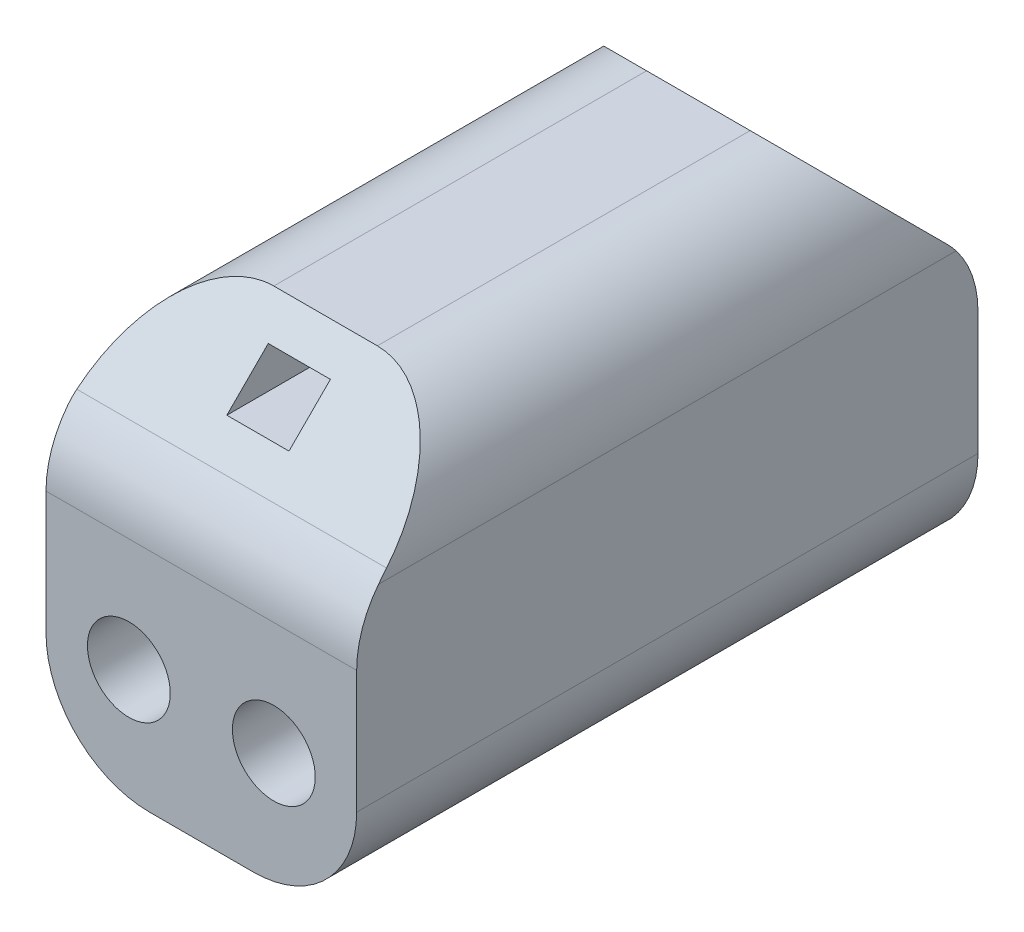
ISO-10303-21;
HEADER;
FILE_DESCRIPTION(('STEP AP214'),'2;1');
FILE_NAME('part.step','',(''),(''),'','','');
FILE_SCHEMA(('AUTOMOTIVE_DESIGN { 1 0 10303 214 1 1 1 1 }'));
ENDSEC;
DATA;
#1=APPLICATION_CONTEXT('core data for automotive mechanical design processes');
#2=APPLICATION_PROTOCOL_DEFINITION('international standard','automotive_design',2000,#1);
#3=PRODUCT_CONTEXT('',#1,'mechanical');
#4=PRODUCT('Part','Part','',(#3));
#5=PRODUCT_RELATED_PRODUCT_CATEGORY('part','',(#4));
#6=PRODUCT_DEFINITION_FORMATION('','',#4);
#7=PRODUCT_DEFINITION_CONTEXT('part definition',#1,'design');
#8=PRODUCT_DEFINITION('design','',#6,#7);
#9=PRODUCT_DEFINITION_SHAPE('','',#8);
#10=(LENGTH_UNIT() NAMED_UNIT(*) SI_UNIT(.MILLI.,.METRE.));
#11=(NAMED_UNIT(*) PLANE_ANGLE_UNIT() SI_UNIT($,.RADIAN.));
#12=(NAMED_UNIT(*) SI_UNIT($,.STERADIAN.) SOLID_ANGLE_UNIT());
#13=UNCERTAINTY_MEASURE_WITH_UNIT(LENGTH_MEASURE(1.E-05),#10,'distance_accuracy_value','');
#14=(GEOMETRIC_REPRESENTATION_CONTEXT(3) GLOBAL_UNCERTAINTY_ASSIGNED_CONTEXT((#13)) GLOBAL_UNIT_ASSIGNED_CONTEXT((#10,
#11,#12)) REPRESENTATION_CONTEXT('',''));
#15=CARTESIAN_POINT('',(0.,0.,0.));
#16=DIRECTION('',(0.,0.,1.));
#17=DIRECTION('',(1.,0.,0.));
#18=AXIS2_PLACEMENT_3D('',#15,#16,#17);
#19=CARTESIAN_POINT('',(7.5,-29.2167347703134,-22.0328397192485));
#20=DIRECTION('',(0.,1.,0.));
#21=DIRECTION('',(0.,0.,1.));
#22=AXIS2_PLACEMENT_3D('',#19,#20,#21);
#23=PLANE('',#22);
#24=DIRECTION('',(-1.,0.,0.));
#25=VECTOR('',#24,1.);
#26=CARTESIAN_POINT('',(7.5,-29.2167347703134,-22.0328397192485));
#27=LINE('',#26,#25);
#28=CARTESIAN_POINT('',(2.5,-29.2167347703134,-22.0328397192485));
#29=VERTEX_POINT('',#28);
#30=CARTESIAN_POINT('',(-2.5,-29.2167347703134,-22.0328397192485));
#31=VERTEX_POINT('',#30);
#32=EDGE_CURVE('E224',#29,#31,#27,.T.);
#33=ORIENTED_EDGE('',*,*,#32,.F.);
#34=DIRECTION('',(0.,0.,-1.));
#35=VECTOR('',#34,1.);
#36=CARTESIAN_POINT('',(2.5,-29.2167347703134,-22.0328397192485));
#37=LINE('',#36,#35);
#38=CARTESIAN_POINT('',(2.5,-29.2167347703134,7.96716028075147));
#39=VERTEX_POINT('',#38);
#40=EDGE_CURVE('E290',#29,#39,#37,.F.);
#41=ORIENTED_EDGE('',*,*,#40,.T.);
#42=DIRECTION('',(-1.,0.,0.));
#43=VECTOR('',#42,1.);
#44=CARTESIAN_POINT('',(7.5,-29.2167347703134,7.96716028075147));
#45=LINE('',#44,#43);
#46=CARTESIAN_POINT('',(-2.5,-29.2167347703134,7.96716028075147));
#47=VERTEX_POINT('',#46);
#48=EDGE_CURVE('E202',#39,#47,#45,.T.);
#49=ORIENTED_EDGE('',*,*,#48,.T.);
#50=DIRECTION('',(0.,0.,-1.));
#51=VECTOR('',#50,1.);
#52=CARTESIAN_POINT('',(-2.5,-29.2167347703134,-22.0328397192485));
#53=LINE('',#52,#51);
#54=EDGE_CURVE('E284',#47,#31,#53,.T.);
#55=ORIENTED_EDGE('',*,*,#54,.T.);
#56=EDGE_LOOP('',(#33,#41,#49,#55));
#57=FACE_BOUND('',#56,.T.);
#58=ADVANCED_FACE('F42',(#57),#23,.F.);
#59=CARTESIAN_POINT('',(7.5,-16.2167347703134,-22.0328397192485));
#60=DIRECTION('',(0.,0.,1.));
#61=DIRECTION('',(0.,-1.,0.));
#62=AXIS2_PLACEMENT_3D('',#59,#60,#61);
#63=PLANE('',#62);
#64=CARTESIAN_POINT('',(3.5,-23.7522686762461,-22.0328397192485));
#65=DIRECTION('',(0.,0.,1.));
#66=DIRECTION('',(0.,-1.,0.));
#67=AXIS2_PLACEMENT_3D('',#64,#65,#66);
#68=CIRCLE('',#67,2.);
#69=CARTESIAN_POINT('',(3.5,-25.7522686762461,-22.0328397192485));
#70=VERTEX_POINT('',#69);
#71=EDGE_CURVE('E171',#70,#70,#68,.T.);
#72=ORIENTED_EDGE('',*,*,#71,.T.);
#73=EDGE_LOOP('',(#72));
#74=FACE_BOUND('',#73,.T.);
#75=CARTESIAN_POINT('',(-3.5,-23.7522686762461,-22.0328397192485));
#76=DIRECTION('',(0.,0.,1.));
#77=DIRECTION('',(0.,-1.,0.));
#78=AXIS2_PLACEMENT_3D('',#75,#76,#77);
#79=CIRCLE('',#78,2.);
#80=CARTESIAN_POINT('',(-3.5,-25.7522686762461,-22.0328397192485));
#81=VERTEX_POINT('',#80);
#82=EDGE_CURVE('E260',#81,#81,#79,.T.);
#83=ORIENTED_EDGE('',*,*,#82,.T.);
#84=EDGE_LOOP('',(#83));
#85=FACE_BOUND('',#84,.T.);
#86=DIRECTION('',(0.,1.,0.));
#87=VECTOR('',#86,1.);
#88=CARTESIAN_POINT('',(7.5,-16.2167347703134,-22.0328397192485));
#89=LINE('',#88,#87);
#90=CARTESIAN_POINT('',(7.5,-24.2167347703134,-22.0328397192485));
#91=VERTEX_POINT('',#90);
#92=CARTESIAN_POINT('',(7.5,-18.2878025821789,-22.0328397192485));
#93=VERTEX_POINT('',#92);
#94=EDGE_CURVE('E199',#91,#93,#89,.T.);
#95=ORIENTED_EDGE('',*,*,#94,.F.);
#96=CARTESIAN_POINT('',(2.5,-24.2167347703134,-22.0328397192485));
#97=DIRECTION('',(0.,0.,1.));
#98=DIRECTION('',(0.,-1.,0.));
#99=AXIS2_PLACEMENT_3D('',#96,#97,#98);
#100=CIRCLE('',#99,5.);
#101=EDGE_CURVE('E282',#91,#29,#100,.F.);
#102=ORIENTED_EDGE('',*,*,#101,.T.);
#103=ORIENTED_EDGE('',*,*,#32,.T.);
#104=CARTESIAN_POINT('',(-2.5,-24.2167347703134,-22.0328397192485));
#105=DIRECTION('',(0.,0.,1.));
#106=DIRECTION('',(0.,-1.,0.));
#107=AXIS2_PLACEMENT_3D('',#104,#105,#106);
#108=CIRCLE('',#107,5.);
#109=CARTESIAN_POINT('',(-7.5,-24.2167347703134,-22.0328397192485));
#110=VERTEX_POINT('',#109);
#111=EDGE_CURVE('E277',#31,#110,#108,.F.);
#112=ORIENTED_EDGE('',*,*,#111,.T.);
#113=DIRECTION('',(0.,1.,0.));
#114=VECTOR('',#113,1.);
#115=CARTESIAN_POINT('',(-7.5,-16.2167347703134,-22.0328397192485));
#116=LINE('',#115,#114);
#117=CARTESIAN_POINT('',(-7.5,-18.2878025821789,-22.0328397192485));
#118=VERTEX_POINT('',#117);
#119=EDGE_CURVE('E186',#110,#118,#116,.T.);
#120=ORIENTED_EDGE('',*,*,#119,.T.);
#121=DIRECTION('',(-1.,0.,0.));
#122=VECTOR('',#121,1.);
#123=CARTESIAN_POINT('',(7.5,-18.2878025821789,-22.0328397192485));
#124=LINE('',#123,#122);
#125=EDGE_CURVE('E248',#118,#93,#124,.F.);
#126=ORIENTED_EDGE('',*,*,#125,.T.);
#127=EDGE_LOOP('',(#95,#102,#103,#112,#120,#126));
#128=FACE_BOUND('',#127,.T.);
#129=ADVANCED_FACE('F363',(#74,#85,#128),#63,.F.);
#130=CARTESIAN_POINT('',(7.5,-10.2167347703134,-16.0328397192485));
#131=DIRECTION('',(0.,-0.707106781186552,0.707106781186543));
#132=DIRECTION('',(0.,-0.707106781186543,-0.707106781186552));
#133=AXIS2_PLACEMENT_3D('',#130,#131,#132);
#134=PLANE('',#133);
#135=DIRECTION('',(1.,0.,0.));
#136=VECTOR('',#135,1.);
#137=CARTESIAN_POINT('',(7.5,-13.4845017232798,-19.3006066722149));
#138=LINE('',#137,#136);
#139=CARTESIAN_POINT('',(-1.5,-13.4845017232798,-19.3006066722149));
#140=VERTEX_POINT('',#139);
#141=CARTESIAN_POINT('',(1.5,-13.4845017232798,-19.3006066722149));
#142=VERTEX_POINT('',#141);
#143=EDGE_CURVE('E190',#140,#142,#138,.T.);
#144=ORIENTED_EDGE('',*,*,#143,.T.);
#145=DIRECTION('',(0.,0.707106781186543,0.707106781186552));
#146=VECTOR('',#145,1.);
#147=CARTESIAN_POINT('',(1.5,-10.2167347703134,-16.0328397192485));
#148=LINE('',#147,#146);
#149=CARTESIAN_POINT('',(1.5,-11.4845017232798,-17.3006066722148));
#150=VERTEX_POINT('',#149);
#151=EDGE_CURVE('E176',#142,#150,#148,.T.);
#152=ORIENTED_EDGE('',*,*,#151,.T.);
#153=DIRECTION('',(-1.,0.,0.));
#154=VECTOR('',#153,1.);
#155=CARTESIAN_POINT('',(7.5,-11.4845017232798,-17.3006066722148));
#156=LINE('',#155,#154);
#157=CARTESIAN_POINT('',(-1.5,-11.4845017232798,-17.3006066722148));
#158=VERTEX_POINT('',#157);
#159=EDGE_CURVE('E160',#150,#158,#156,.T.);
#160=ORIENTED_EDGE('',*,*,#159,.T.);
#161=DIRECTION('',(0.,-0.707106781186543,-0.707106781186552));
#162=VECTOR('',#161,1.);
#163=CARTESIAN_POINT('',(-1.5,-10.2167347703134,-16.0328397192485));
#164=LINE('',#163,#162);
#165=EDGE_CURVE('E167',#158,#140,#164,.T.);
#166=ORIENTED_EDGE('',*,*,#165,.T.);
#167=EDGE_LOOP('',(#144,#152,#160,#166));
#168=FACE_BOUND('',#167,.T.);
#169=DIRECTION('',(-1.,0.,0.));
#170=VECTOR('',#169,1.);
#171=CARTESIAN_POINT('',(7.5,-10.2167347703134,-16.0328397192485));
#172=LINE('',#171,#170);
#173=CARTESIAN_POINT('',(2.5,-10.2167347703134,-16.0328397192485));
#174=VERTEX_POINT('',#173);
#175=CARTESIAN_POINT('',(-2.5,-10.2167347703134,-16.0328397192485));
#176=VERTEX_POINT('',#175);
#177=EDGE_CURVE('E220',#174,#176,#172,.T.);
#178=ORIENTED_EDGE('',*,*,#177,.F.);
#179=CARTESIAN_POINT('',(2.5,-15.2167347703134,-21.0328397192485));
#180=DIRECTION('',(0.,-0.707106781186552,0.707106781186543));
#181=DIRECTION('',(0.,0.707106781186543,0.707106781186552));
#182=AXIS2_PLACEMENT_3D('',#179,#180,#181);
#183=ELLIPSE('',#182,7.07106781186552,5.);
#184=CARTESIAN_POINT('',(7.47838038396645,-14.7522686762461,-20.5683736251812));
#185=VERTEX_POINT('',#184);
#186=EDGE_CURVE('E412',#174,#185,#183,.F.);
#187=ORIENTED_EDGE('',*,*,#186,.T.);
#188=DIRECTION('',(-1.,0.,0.));
#189=VECTOR('',#188,1.);
#190=CARTESIAN_POINT('',(7.5,-14.7522686762461,-20.5683736251812));
#191=LINE('',#190,#189);
#192=CARTESIAN_POINT('',(-7.47838038396644,-14.7522686762461,-20.5683736251812));
#193=VERTEX_POINT('',#192);
#194=EDGE_CURVE('E246',#185,#193,#191,.T.);
#195=ORIENTED_EDGE('',*,*,#194,.T.);
#196=CARTESIAN_POINT('',(-2.5,-15.2167347703134,-21.0328397192485));
#197=DIRECTION('',(0.,-0.707106781186552,0.707106781186543));
#198=DIRECTION('',(0.,-0.707106781186543,-0.707106781186552));
#199=AXIS2_PLACEMENT_3D('',#196,#197,#198);
#200=ELLIPSE('',#199,7.07106781186552,5.);
#201=EDGE_CURVE('E408',#193,#176,#200,.F.);
#202=ORIENTED_EDGE('',*,*,#201,.T.);
#203=EDGE_LOOP('',(#178,#187,#195,#202));
#204=FACE_BOUND('',#203,.T.);
#205=ADVANCED_FACE('F184',(#168,#204),#134,.F.);
#206=CARTESIAN_POINT('',(7.5,-10.2167347703134,1.9671602807514));
#207=DIRECTION('',(0.,-1.,0.));
#208=DIRECTION('',(0.,0.,-1.));
#209=AXIS2_PLACEMENT_3D('',#206,#207,#208);
#210=PLANE('',#209);
#211=DIRECTION('',(-1.,0.,0.));
#212=VECTOR('',#211,1.);
#213=CARTESIAN_POINT('',(7.5,-10.2167347703134,1.9671602807514));
#214=LINE('',#213,#212);
#215=CARTESIAN_POINT('',(2.5,-10.2167347703134,1.9671602807514));
#216=VERTEX_POINT('',#215);
#217=CARTESIAN_POINT('',(-2.5,-10.2167347703134,1.9671602807514));
#218=VERTEX_POINT('',#217);
#219=EDGE_CURVE('E212',#216,#218,#214,.T.);
#220=ORIENTED_EDGE('',*,*,#219,.F.);
#221=DIRECTION('',(0.,0.,1.));
#222=VECTOR('',#221,1.);
#223=CARTESIAN_POINT('',(2.5,-10.2167347703134,1.9671602807514));
#224=LINE('',#223,#222);
#225=EDGE_CURVE('E406',#216,#174,#224,.F.);
#226=ORIENTED_EDGE('',*,*,#225,.T.);
#227=ORIENTED_EDGE('',*,*,#177,.T.);
#228=DIRECTION('',(0.,0.,1.));
#229=VECTOR('',#228,1.);
#230=CARTESIAN_POINT('',(-2.5,-10.2167347703134,1.9671602807514));
#231=LINE('',#230,#229);
#232=EDGE_CURVE('E397',#176,#218,#231,.T.);
#233=ORIENTED_EDGE('',*,*,#232,.T.);
#234=EDGE_LOOP('',(#220,#226,#227,#233));
#235=FACE_BOUND('',#234,.T.);
#236=ADVANCED_FACE('F420',(#235),#210,.F.);
#237=CARTESIAN_POINT('',(7.5,-16.2167347703134,7.96716028075146));
#238=DIRECTION('',(0.,-0.707106781186551,-0.707106781186544));
#239=DIRECTION('',(0.,0.707106781186544,-0.707106781186551));
#240=AXIS2_PLACEMENT_3D('',#237,#238,#239);
#241=PLANE('',#240);
#242=DIRECTION('',(1.,0.,0.));
#243=VECTOR('',#242,1.);
#244=CARTESIAN_POINT('',(7.5,-11.4845017232798,3.23492723371779));
#245=LINE('',#244,#243);
#246=CARTESIAN_POINT('',(-1.5,-11.4845017232798,3.23492723371779));
#247=VERTEX_POINT('',#246);
#248=CARTESIAN_POINT('',(1.5,-11.4845017232798,3.23492723371779));
#249=VERTEX_POINT('',#248);
#250=EDGE_CURVE('E254',#247,#249,#245,.T.);
#251=ORIENTED_EDGE('',*,*,#250,.T.);
#252=DIRECTION('',(0.,-0.707106781186544,0.707106781186551));
#253=VECTOR('',#252,1.);
#254=CARTESIAN_POINT('',(1.5,-16.2167347703134,7.96716028075146));
#255=LINE('',#254,#253);
#256=CARTESIAN_POINT('',(1.5,-13.4845017232798,5.23492723371781));
#257=VERTEX_POINT('',#256);
#258=EDGE_CURVE('E177',#249,#257,#255,.T.);
#259=ORIENTED_EDGE('',*,*,#258,.T.);
#260=DIRECTION('',(-1.,0.,0.));
#261=VECTOR('',#260,1.);
#262=CARTESIAN_POINT('',(7.5,-13.4845017232798,5.23492723371781));
#263=LINE('',#262,#261);
#264=CARTESIAN_POINT('',(-1.5,-13.4845017232798,5.23492723371779));
#265=VERTEX_POINT('',#264);
#266=EDGE_CURVE('E270',#257,#265,#263,.T.);
#267=ORIENTED_EDGE('',*,*,#266,.T.);
#268=DIRECTION('',(0.,0.707106781186544,-0.707106781186551));
#269=VECTOR('',#268,1.);
#270=CARTESIAN_POINT('',(-1.5,-16.2167347703134,7.96716028075146));
#271=LINE('',#270,#269);
#272=EDGE_CURVE('E264',#265,#247,#271,.T.);
#273=ORIENTED_EDGE('',*,*,#272,.T.);
#274=EDGE_LOOP('',(#251,#259,#267,#273));
#275=FACE_BOUND('',#274,.T.);
#276=DIRECTION('',(-1.,0.,0.));
#277=VECTOR('',#276,1.);
#278=CARTESIAN_POINT('',(7.5,-14.7522686762461,6.50269418668419));
#279=LINE('',#278,#277);
#280=CARTESIAN_POINT('',(-7.47838038396644,-14.7522686762461,6.50269418668419));
#281=VERTEX_POINT('',#280);
#282=CARTESIAN_POINT('',(7.47838038396645,-14.7522686762461,6.50269418668419));
#283=VERTEX_POINT('',#282);
#284=EDGE_CURVE('E232',#281,#283,#279,.F.);
#285=ORIENTED_EDGE('',*,*,#284,.T.);
#286=CARTESIAN_POINT('',(2.5,-15.2167347703134,6.96716028075145));
#287=DIRECTION('',(0.,-0.707106781186551,-0.707106781186544));
#288=DIRECTION('',(0.,-0.707106781186544,0.707106781186551));
#289=AXIS2_PLACEMENT_3D('',#286,#287,#288);
#290=ELLIPSE('',#289,7.07106781186551,5.);
#291=EDGE_CURVE('E394',#283,#216,#290,.F.);
#292=ORIENTED_EDGE('',*,*,#291,.T.);
#293=ORIENTED_EDGE('',*,*,#219,.T.);
#294=CARTESIAN_POINT('',(-2.5,-15.2167347703134,6.96716028075145));
#295=DIRECTION('',(0.,-0.707106781186551,-0.707106781186544));
#296=DIRECTION('',(0.,0.707106781186544,-0.707106781186551));
#297=AXIS2_PLACEMENT_3D('',#294,#295,#296);
#298=ELLIPSE('',#297,7.07106781186551,5.);
#299=EDGE_CURVE('E399',#218,#281,#298,.F.);
#300=ORIENTED_EDGE('',*,*,#299,.T.);
#301=EDGE_LOOP('',(#285,#292,#293,#300));
#302=FACE_BOUND('',#301,.T.);
#303=ADVANCED_FACE('F417',(#275,#302),#241,.F.);
#304=CARTESIAN_POINT('',(7.5,-29.2167347703134,7.96716028075147));
#305=DIRECTION('',(0.,0.,-1.));
#306=DIRECTION('',(0.,1.,0.));
#307=AXIS2_PLACEMENT_3D('',#304,#305,#306);
#308=PLANE('',#307);
#309=CARTESIAN_POINT('',(3.5,-23.7522686762461,7.96716028075146));
#310=DIRECTION('',(0.,0.,-1.));
#311=DIRECTION('',(0.,1.,0.));
#312=AXIS2_PLACEMENT_3D('',#309,#310,#311);
#313=CIRCLE('',#312,2.);
#314=CARTESIAN_POINT('',(3.5,-21.7522686762461,7.96716028075146));
#315=VERTEX_POINT('',#314);
#316=EDGE_CURVE('E257',#315,#315,#313,.T.);
#317=ORIENTED_EDGE('',*,*,#316,.T.);
#318=EDGE_LOOP('',(#317));
#319=FACE_BOUND('',#318,.T.);
#320=CARTESIAN_POINT('',(-3.5,-23.7522686762461,7.96716028075146));
#321=DIRECTION('',(0.,0.,-1.));
#322=DIRECTION('',(0.,1.,0.));
#323=AXIS2_PLACEMENT_3D('',#320,#321,#322);
#324=CIRCLE('',#323,2.);
#325=CARTESIAN_POINT('',(-3.5,-21.7522686762461,7.96716028075146));
#326=VERTEX_POINT('',#325);
#327=EDGE_CURVE('E185',#326,#326,#324,.T.);
#328=ORIENTED_EDGE('',*,*,#327,.T.);
#329=EDGE_LOOP('',(#328));
#330=FACE_BOUND('',#329,.T.);
#331=ORIENTED_EDGE('',*,*,#48,.F.);
#332=CARTESIAN_POINT('',(2.5,-24.2167347703134,7.96716028075147));
#333=DIRECTION('',(0.,0.,-1.));
#334=DIRECTION('',(0.,1.,0.));
#335=AXIS2_PLACEMENT_3D('',#332,#333,#334);
#336=CIRCLE('',#335,5.);
#337=CARTESIAN_POINT('',(7.5,-24.2167347703134,7.96716028075147));
#338=VERTEX_POINT('',#337);
#339=EDGE_CURVE('E295',#39,#338,#336,.F.);
#340=ORIENTED_EDGE('',*,*,#339,.T.);
#341=DIRECTION('',(0.,-1.,0.));
#342=VECTOR('',#341,1.);
#343=CARTESIAN_POINT('',(7.5,-29.2167347703134,7.96716028075147));
#344=LINE('',#343,#342);
#345=CARTESIAN_POINT('',(7.5,-18.2878025821789,7.96716028075146));
#346=VERTEX_POINT('',#345);
#347=EDGE_CURVE('E201',#346,#338,#344,.T.);
#348=ORIENTED_EDGE('',*,*,#347,.F.);
#349=DIRECTION('',(-1.,0.,0.));
#350=VECTOR('',#349,1.);
#351=CARTESIAN_POINT('',(7.5,-18.2878025821789,7.96716028075146));
#352=LINE('',#351,#350);
#353=CARTESIAN_POINT('',(-7.5,-18.2878025821789,7.96716028075146));
#354=VERTEX_POINT('',#353);
#355=EDGE_CURVE('E222',#346,#354,#352,.T.);
#356=ORIENTED_EDGE('',*,*,#355,.T.);
#357=DIRECTION('',(0.,-1.,0.));
#358=VECTOR('',#357,1.);
#359=CARTESIAN_POINT('',(-7.5,-29.2167347703134,7.96716028075147));
#360=LINE('',#359,#358);
#361=CARTESIAN_POINT('',(-7.5,-24.2167347703134,7.96716028075147));
#362=VERTEX_POINT('',#361);
#363=EDGE_CURVE('E193',#354,#362,#360,.T.);
#364=ORIENTED_EDGE('',*,*,#363,.T.);
#365=CARTESIAN_POINT('',(-2.5,-24.2167347703134,7.96716028075146));
#366=DIRECTION('',(0.,0.,-1.));
#367=DIRECTION('',(0.,1.,0.));
#368=AXIS2_PLACEMENT_3D('',#365,#366,#367);
#369=CIRCLE('',#368,5.);
#370=EDGE_CURVE('E293',#362,#47,#369,.F.);
#371=ORIENTED_EDGE('',*,*,#370,.T.);
#372=EDGE_LOOP('',(#331,#340,#348,#356,#364,#371));
#373=FACE_BOUND('',#372,.T.);
#374=ADVANCED_FACE('F380',(#319,#330,#373),#308,.F.);
#375=CARTESIAN_POINT('',(7.5,0.,0.));
#376=DIRECTION('',(-1.,0.,0.));
#377=DIRECTION('',(0.,0.,1.));
#378=AXIS2_PLACEMENT_3D('',#375,#376,#377);
#379=PLANE('',#378);
#380=CARTESIAN_POINT('',(7.5,-18.2878025821789,-17.0328397192485));
#381=DIRECTION('',(-1.,0.,0.));
#382=DIRECTION('',(0.,0.,1.));
#383=AXIS2_PLACEMENT_3D('',#380,#381,#382);
#384=CIRCLE('',#383,5.);
#385=CARTESIAN_POINT('',(7.5,-15.2167347703134,-20.978538959551));
#386=VERTEX_POINT('',#385);
#387=EDGE_CURVE('E237',#93,#386,#384,.F.);
#388=ORIENTED_EDGE('',*,*,#387,.T.);
#389=DIRECTION('',(0.,0.,1.));
#390=VECTOR('',#389,1.);
#391=CARTESIAN_POINT('',(7.5,-15.2167347703134,0.));
#392=LINE('',#391,#390);
#393=CARTESIAN_POINT('',(7.5,-15.2167347703134,6.91285952105396));
#394=VERTEX_POINT('',#393);
#395=EDGE_CURVE('E297',#386,#394,#392,.T.);
#396=ORIENTED_EDGE('',*,*,#395,.T.);
#397=CARTESIAN_POINT('',(7.5,-18.2878025821789,2.96716028075146));
#398=DIRECTION('',(-1.,0.,0.));
#399=DIRECTION('',(0.,0.,1.));
#400=AXIS2_PLACEMENT_3D('',#397,#398,#399);
#401=CIRCLE('',#400,5.);
#402=EDGE_CURVE('E243',#394,#346,#401,.F.);
#403=ORIENTED_EDGE('',*,*,#402,.T.);
#404=ORIENTED_EDGE('',*,*,#347,.T.);
#405=DIRECTION('',(0.,0.,-1.));
#406=VECTOR('',#405,1.);
#407=CARTESIAN_POINT('',(7.5,-24.2167347703134,0.));
#408=LINE('',#407,#406);
#409=EDGE_CURVE('E274',#338,#91,#408,.T.);
#410=ORIENTED_EDGE('',*,*,#409,.T.);
#411=ORIENTED_EDGE('',*,*,#94,.T.);
#412=EDGE_LOOP('',(#388,#396,#403,#404,#410,#411));
#413=FACE_BOUND('',#412,.T.);
#414=ADVANCED_FACE('F379',(#413),#379,.F.);
#415=CARTESIAN_POINT('',(-7.5,0.,0.));
#416=DIRECTION('',(-1.,0.,0.));
#417=DIRECTION('',(0.,0.,1.));
#418=AXIS2_PLACEMENT_3D('',#415,#416,#417);
#419=PLANE('',#418);
#420=CARTESIAN_POINT('',(-7.5,-18.2878025821789,2.96716028075146));
#421=DIRECTION('',(-1.,0.,0.));
#422=DIRECTION('',(0.,0.,1.));
#423=AXIS2_PLACEMENT_3D('',#420,#421,#422);
#424=CIRCLE('',#423,5.);
#425=CARTESIAN_POINT('',(-7.5,-15.2167347703134,6.91285952105396));
#426=VERTEX_POINT('',#425);
#427=EDGE_CURVE('E235',#354,#426,#424,.T.);
#428=ORIENTED_EDGE('',*,*,#427,.T.);
#429=DIRECTION('',(0.,0.,1.));
#430=VECTOR('',#429,1.);
#431=CARTESIAN_POINT('',(-7.5,-15.2167347703134,-16.0328397192485));
#432=LINE('',#431,#430);
#433=CARTESIAN_POINT('',(-7.5,-15.2167347703134,-20.978538959551));
#434=VERTEX_POINT('',#433);
#435=EDGE_CURVE('E11',#426,#434,#432,.F.);
#436=ORIENTED_EDGE('',*,*,#435,.T.);
#437=CARTESIAN_POINT('',(-7.5,-18.2878025821789,-17.0328397192485));
#438=DIRECTION('',(-1.,0.,0.));
#439=DIRECTION('',(0.,0.,1.));
#440=AXIS2_PLACEMENT_3D('',#437,#438,#439);
#441=CIRCLE('',#440,5.);
#442=EDGE_CURVE('E230',#434,#118,#441,.T.);
#443=ORIENTED_EDGE('',*,*,#442,.T.);
#444=ORIENTED_EDGE('',*,*,#119,.F.);
#445=DIRECTION('',(0.,0.,-1.));
#446=VECTOR('',#445,1.);
#447=CARTESIAN_POINT('',(-7.5,-24.2167347703134,7.96716028075146));
#448=LINE('',#447,#446);
#449=EDGE_CURVE('E300',#110,#362,#448,.F.);
#450=ORIENTED_EDGE('',*,*,#449,.T.);
#451=ORIENTED_EDGE('',*,*,#363,.F.);
#452=EDGE_LOOP('',(#428,#436,#443,#444,#450,#451));
#453=FACE_BOUND('',#452,.T.);
#454=ADVANCED_FACE('F323',(#453),#419,.T.);
#455=CARTESIAN_POINT('',(7.5,-18.2878025821789,2.96716028075146));
#456=DIRECTION('',(-1.,0.,0.));
#457=DIRECTION('',(0.,0.,1.));
#458=AXIS2_PLACEMENT_3D('',#455,#456,#457);
#459=CYLINDRICAL_SURFACE('',#458,5.);
#460=ORIENTED_EDGE('',*,*,#402,.F.);
#461=CARTESIAN_POINT('',(7.5,-15.2167347703134,6.91285952105396));
#462=CARTESIAN_POINT('',(7.50000022228035,-15.1759009062012,6.8810779011773));
#463=CARTESIAN_POINT('',(7.49949979039581,-15.135562259342,6.84866242103634));
#464=CARTESIAN_POINT('',(7.49757314974649,-15.0559720970149,6.78264715735656));
#465=CARTESIAN_POINT('',(7.49614808047301,-15.0167193053733,6.74904887959135));
#466=CARTESIAN_POINT('',(7.49244735306524,-14.9392973421894,6.68067346355808));
#467=CARTESIAN_POINT('',(7.49017170544814,-14.9011281572548,6.64589633987102));
#468=CARTESIAN_POINT('',(7.48484176544979,-14.8258668557712,6.57516142024654));
#469=CARTESIAN_POINT('',(7.48178651759004,-14.7887761235624,6.53920222301331));
#470=CARTESIAN_POINT('',(7.47838038396645,-14.7522686762461,6.50269418668419));
#471=B_SPLINE_CURVE_WITH_KNOTS('',3,(#461,#462,#463,#464,#465,#466,#467,#468,#469,#470),
.UNSPECIFIED.,.F.,.F.,(4,2,2,2,4),(0.,0.155222217477739,0.310253506834466,0.465282879327944,
0.620503176248758),.UNSPECIFIED.);
#472=EDGE_CURVE('E315',#394,#283,#471,.T.);
#473=ORIENTED_EDGE('',*,*,#472,.T.);
#474=ORIENTED_EDGE('',*,*,#284,.F.);
#475=CARTESIAN_POINT('',(-7.47838038396644,-14.7522686762461,6.50269418668419));
#476=CARTESIAN_POINT('',(-7.48178651759004,-14.7887761235624,6.53920222301331));
#477=CARTESIAN_POINT('',(-7.48484176544979,-14.8258668557712,6.57516142024654));
#478=CARTESIAN_POINT('',(-7.49017170544814,-14.9011281572548,6.64589633987102));
#479=CARTESIAN_POINT('',(-7.49244735306523,-14.9392973421894,6.68067346355808));
#480=CARTESIAN_POINT('',(-7.49614808047301,-15.0167193053733,6.74904887959135));
#481=CARTESIAN_POINT('',(-7.49757314974649,-15.0559720970149,6.78264715735656));
#482=CARTESIAN_POINT('',(-7.4994997903958,-15.135562259342,6.84866242103634));
#483=CARTESIAN_POINT('',(-7.50000022228035,-15.1759009062012,6.8810779011773));
#484=CARTESIAN_POINT('',(-7.5,-15.2167347703134,6.91285952105396));
#485=B_SPLINE_CURVE_WITH_KNOTS('',3,(#475,#476,#477,#478,#479,#480,#481,#482,#483,#484),
.UNSPECIFIED.,.F.,.F.,(4,2,2,2,4),(0.,0.155220296920814,0.310249669414291,0.46528095877102,
0.620503176248758),.UNSPECIFIED.);
#486=EDGE_CURVE('E302',#281,#426,#485,.T.);
#487=ORIENTED_EDGE('',*,*,#486,.T.);
#488=ORIENTED_EDGE('',*,*,#427,.F.);
#489=ORIENTED_EDGE('',*,*,#355,.F.);
#490=EDGE_LOOP('',(#460,#473,#474,#487,#488,#489));
#491=FACE_BOUND('',#490,.T.);
#492=ADVANCED_FACE('F319',(#491),#459,.T.);
#493=CARTESIAN_POINT('',(7.5,-18.2878025821789,-17.0328397192485));
#494=DIRECTION('',(-1.,0.,0.));
#495=DIRECTION('',(0.,0.,1.));
#496=AXIS2_PLACEMENT_3D('',#493,#494,#495);
#497=CYLINDRICAL_SURFACE('',#496,5.);
#498=ORIENTED_EDGE('',*,*,#194,.F.);
#499=CARTESIAN_POINT('',(7.47838038396645,-14.7522686762461,-20.5683736251812));
#500=CARTESIAN_POINT('',(7.48178651759004,-14.7887761235624,-20.6048816615104));
#501=CARTESIAN_POINT('',(7.48484176544979,-14.8258668557712,-20.6408408587436));
#502=CARTESIAN_POINT('',(7.49017170544814,-14.9011281572548,-20.7115757783681));
#503=CARTESIAN_POINT('',(7.49244735306524,-14.9392973421894,-20.7463529020551));
#504=CARTESIAN_POINT('',(7.49614808047301,-15.0167193053733,-20.8147283180884));
#505=CARTESIAN_POINT('',(7.49757314974649,-15.0559720970149,-20.8483265958536));
#506=CARTESIAN_POINT('',(7.49949979039581,-15.135562259342,-20.9143418595334));
#507=CARTESIAN_POINT('',(7.50000022228035,-15.1759009062012,-20.9467573396744));
#508=CARTESIAN_POINT('',(7.5,-15.2167347703134,-20.978538959551));
#509=B_SPLINE_CURVE_WITH_KNOTS('',3,(#499,#500,#501,#502,#503,#504,#505,#506,#507,#508),
.UNSPECIFIED.,.F.,.F.,(4,2,2,2,4),(0.,0.155220296920812,0.31024966941429,0.465280958771017,
0.620503176248758),.UNSPECIFIED.);
#510=EDGE_CURVE('E53',#185,#386,#509,.T.);
#511=ORIENTED_EDGE('',*,*,#510,.T.);
#512=ORIENTED_EDGE('',*,*,#387,.F.);
#513=ORIENTED_EDGE('',*,*,#125,.F.);
#514=ORIENTED_EDGE('',*,*,#442,.F.);
#515=CARTESIAN_POINT('',(-7.5,-15.2167347703134,-20.978538959551));
#516=CARTESIAN_POINT('',(-7.50000022228035,-15.1759009062012,-20.9467573396744));
#517=CARTESIAN_POINT('',(-7.4994997903958,-15.135562259342,-20.9143418595334));
#518=CARTESIAN_POINT('',(-7.49757314974649,-15.0559720970149,-20.8483265958536));
#519=CARTESIAN_POINT('',(-7.49614808047301,-15.0167193053733,-20.8147283180884));
#520=CARTESIAN_POINT('',(-7.49244735306523,-14.9392973421894,-20.7463529020551));
#521=CARTESIAN_POINT('',(-7.49017170544814,-14.9011281572548,-20.7115757783681));
#522=CARTESIAN_POINT('',(-7.48484176544979,-14.8258668557712,-20.6408408587436));
#523=CARTESIAN_POINT('',(-7.48178651759004,-14.7887761235624,-20.6048816615104));
#524=CARTESIAN_POINT('',(-7.47838038396644,-14.7522686762461,-20.5683736251812));
#525=B_SPLINE_CURVE_WITH_KNOTS('',3,(#515,#516,#517,#518,#519,#520,#521,#522,#523,#524),
.UNSPECIFIED.,.F.,.F.,(4,2,2,2,4),(0.,0.155222217477741,0.310253506834468,0.465282879327945,
0.620503176248758),.UNSPECIFIED.);
#526=EDGE_CURVE('E67',#434,#193,#525,.T.);
#527=ORIENTED_EDGE('',*,*,#526,.T.);
#528=EDGE_LOOP('',(#498,#511,#512,#513,#514,#527));
#529=FACE_BOUND('',#528,.T.);
#530=ADVANCED_FACE('F322',(#529),#497,.T.);
#531=CARTESIAN_POINT('',(-3.5,-23.7522686762461,-100.));
#532=DIRECTION('',(0.,0.,1.));
#533=DIRECTION('',(1.,0.,0.));
#534=AXIS2_PLACEMENT_3D('',#531,#532,#533);
#535=CYLINDRICAL_SURFACE('',#534,2.);
#536=ORIENTED_EDGE('',*,*,#327,.F.);
#537=EDGE_LOOP('',(#536));
#538=FACE_BOUND('',#537,.T.);
#539=ORIENTED_EDGE('',*,*,#82,.F.);
#540=EDGE_LOOP('',(#539));
#541=FACE_BOUND('',#540,.T.);
#542=ADVANCED_FACE('F334',(#538,#541),#535,.F.);
#543=CARTESIAN_POINT('',(3.5,-23.7522686762461,-100.));
#544=DIRECTION('',(0.,0.,1.));
#545=DIRECTION('',(1.,0.,0.));
#546=AXIS2_PLACEMENT_3D('',#543,#544,#545);
#547=CYLINDRICAL_SURFACE('',#546,2.);
#548=ORIENTED_EDGE('',*,*,#316,.F.);
#549=EDGE_LOOP('',(#548));
#550=FACE_BOUND('',#549,.T.);
#551=ORIENTED_EDGE('',*,*,#71,.F.);
#552=EDGE_LOOP('',(#551));
#553=FACE_BOUND('',#552,.T.);
#554=ADVANCED_FACE('F544',(#550,#553),#547,.F.);
#555=CARTESIAN_POINT('',(1.5,-11.4845017232798,-100.));
#556=DIRECTION('',(1.,0.,0.));
#557=DIRECTION('',(0.,1.,0.));
#558=AXIS2_PLACEMENT_3D('',#555,#556,#557);
#559=PLANE('',#558);
#560=DIRECTION('',(0.,0.,1.));
#561=VECTOR('',#560,1.);
#562=CARTESIAN_POINT('',(1.5,-13.4845017232798,-100.));
#563=LINE('',#562,#561);
#564=EDGE_CURVE('E578',#142,#257,#563,.T.);
#565=ORIENTED_EDGE('',*,*,#564,.T.);
#566=ORIENTED_EDGE('',*,*,#258,.F.);
#567=DIRECTION('',(0.,0.,1.));
#568=VECTOR('',#567,1.);
#569=CARTESIAN_POINT('',(1.5,-11.4845017232798,-100.));
#570=LINE('',#569,#568);
#571=EDGE_CURVE('E163',#150,#249,#570,.T.);
#572=ORIENTED_EDGE('',*,*,#571,.F.);
#573=ORIENTED_EDGE('',*,*,#151,.F.);
#574=EDGE_LOOP('',(#565,#566,#572,#573));
#575=FACE_BOUND('',#574,.T.);
#576=ADVANCED_FACE('F174',(#575),#559,.F.);
#577=CARTESIAN_POINT('',(-1.5,-13.4845017232798,-100.));
#578=DIRECTION('',(0.,-1.,0.));
#579=DIRECTION('',(0.,0.,-1.));
#580=AXIS2_PLACEMENT_3D('',#577,#578,#579);
#581=PLANE('',#580);
#582=DIRECTION('',(0.,0.,1.));
#583=VECTOR('',#582,1.);
#584=CARTESIAN_POINT('',(-1.5,-13.4845017232798,-100.));
#585=LINE('',#584,#583);
#586=EDGE_CURVE('E590',#140,#265,#585,.T.);
#587=ORIENTED_EDGE('',*,*,#586,.T.);
#588=ORIENTED_EDGE('',*,*,#266,.F.);
#589=ORIENTED_EDGE('',*,*,#564,.F.);
#590=ORIENTED_EDGE('',*,*,#143,.F.);
#591=EDGE_LOOP('',(#587,#588,#589,#590));
#592=FACE_BOUND('',#591,.T.);
#593=ADVANCED_FACE('F521',(#592),#581,.F.);
#594=CARTESIAN_POINT('',(-1.5,-11.4845017232798,-100.));
#595=DIRECTION('',(-1.,0.,0.));
#596=DIRECTION('',(0.,-1.,0.));
#597=AXIS2_PLACEMENT_3D('',#594,#595,#596);
#598=PLANE('',#597);
#599=DIRECTION('',(0.,0.,1.));
#600=VECTOR('',#599,1.);
#601=CARTESIAN_POINT('',(-1.5,-11.4845017232798,-100.));
#602=LINE('',#601,#600);
#603=EDGE_CURVE('E165',#158,#247,#602,.T.);
#604=ORIENTED_EDGE('',*,*,#603,.T.);
#605=ORIENTED_EDGE('',*,*,#272,.F.);
#606=ORIENTED_EDGE('',*,*,#586,.F.);
#607=ORIENTED_EDGE('',*,*,#165,.F.);
#608=EDGE_LOOP('',(#604,#605,#606,#607));
#609=FACE_BOUND('',#608,.T.);
#610=ADVANCED_FACE('F516',(#609),#598,.F.);
#611=CARTESIAN_POINT('',(-1.5,-11.4845017232798,-100.));
#612=DIRECTION('',(0.,1.,0.));
#613=DIRECTION('',(0.,0.,1.));
#614=AXIS2_PLACEMENT_3D('',#611,#612,#613);
#615=PLANE('',#614);
#616=ORIENTED_EDGE('',*,*,#571,.T.);
#617=ORIENTED_EDGE('',*,*,#250,.F.);
#618=ORIENTED_EDGE('',*,*,#603,.F.);
#619=ORIENTED_EDGE('',*,*,#159,.F.);
#620=EDGE_LOOP('',(#616,#617,#618,#619));
#621=FACE_BOUND('',#620,.T.);
#622=ADVANCED_FACE('F157',(#621),#615,.F.);
#623=CARTESIAN_POINT('',(2.5,-24.2167347703134,0.));
#624=DIRECTION('',(0.,0.,-1.));
#625=DIRECTION('',(0.,1.,0.));
#626=AXIS2_PLACEMENT_3D('',#623,#624,#625);
#627=CYLINDRICAL_SURFACE('',#626,5.);
#628=ORIENTED_EDGE('',*,*,#339,.F.);
#629=ORIENTED_EDGE('',*,*,#40,.F.);
#630=ORIENTED_EDGE('',*,*,#101,.F.);
#631=ORIENTED_EDGE('',*,*,#409,.F.);
#632=EDGE_LOOP('',(#628,#629,#630,#631));
#633=FACE_BOUND('',#632,.T.);
#634=ADVANCED_FACE('F331',(#633),#627,.T.);
#635=CARTESIAN_POINT('',(-2.5,-24.2167347703134,-22.0328397192485));
#636=DIRECTION('',(0.,0.,1.));
#637=DIRECTION('',(0.,-1.,0.));
#638=AXIS2_PLACEMENT_3D('',#635,#636,#637);
#639=CYLINDRICAL_SURFACE('',#638,5.);
#640=ORIENTED_EDGE('',*,*,#370,.F.);
#641=ORIENTED_EDGE('',*,*,#449,.F.);
#642=ORIENTED_EDGE('',*,*,#111,.F.);
#643=ORIENTED_EDGE('',*,*,#54,.F.);
#644=EDGE_LOOP('',(#640,#641,#642,#643));
#645=FACE_BOUND('',#644,.T.);
#646=ADVANCED_FACE('F349',(#645),#639,.T.);
#647=CARTESIAN_POINT('',(2.5,-15.2167347703134,0.));
#648=DIRECTION('',(0.,0.,1.));
#649=DIRECTION('',(1.,0.,0.));
#650=AXIS2_PLACEMENT_3D('',#647,#648,#649);
#651=CYLINDRICAL_SURFACE('',#650,5.);
#652=ORIENTED_EDGE('',*,*,#186,.F.);
#653=ORIENTED_EDGE('',*,*,#225,.F.);
#654=ORIENTED_EDGE('',*,*,#291,.F.);
#655=ORIENTED_EDGE('',*,*,#472,.F.);
#656=ORIENTED_EDGE('',*,*,#395,.F.);
#657=ORIENTED_EDGE('',*,*,#510,.F.);
#658=EDGE_LOOP('',(#652,#653,#654,#655,#656,#657));
#659=FACE_BOUND('',#658,.T.);
#660=ADVANCED_FACE('F347',(#659),#651,.T.);
#661=CARTESIAN_POINT('',(-2.5,-15.2167347703134,1.9671602807514));
#662=DIRECTION('',(0.,0.,-1.));
#663=DIRECTION('',(-1.,0.,0.));
#664=AXIS2_PLACEMENT_3D('',#661,#662,#663);
#665=CYLINDRICAL_SURFACE('',#664,5.);
#666=ORIENTED_EDGE('',*,*,#526,.F.);
#667=ORIENTED_EDGE('',*,*,#435,.F.);
#668=ORIENTED_EDGE('',*,*,#486,.F.);
#669=ORIENTED_EDGE('',*,*,#299,.F.);
#670=ORIENTED_EDGE('',*,*,#232,.F.);
#671=ORIENTED_EDGE('',*,*,#201,.F.);
#672=EDGE_LOOP('',(#666,#667,#668,#669,#670,#671));
#673=FACE_BOUND('',#672,.T.);
#674=ADVANCED_FACE('F46',(#673),#665,.T.);
#675=CLOSED_SHELL('',(#58,#129,#205,#236,#303,#374,#414,#454,#492,#530,#542,#554,#576,#593,#610,
#622,#634,#646,#660,#674));
#676=MANIFOLD_SOLID_BREP('B2',#675);
#677=ADVANCED_BREP_SHAPE_REPRESENTATION('',(#18,#676),#14);
#678=SHAPE_DEFINITION_REPRESENTATION(#9,#677);
ENDSEC;
END-ISO-10303-21;
